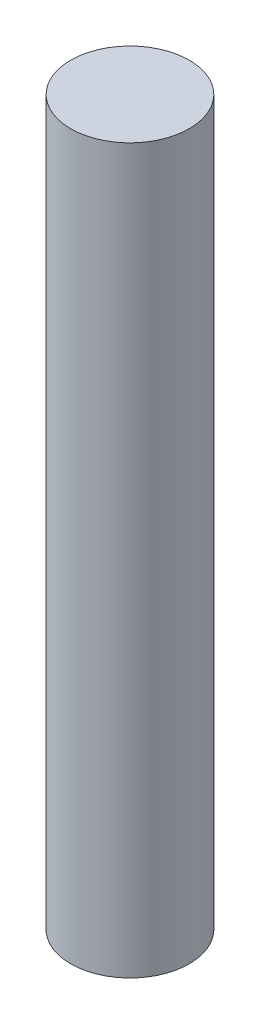
ISO-10303-21;
HEADER;
FILE_DESCRIPTION(('STEP AP214'),'2;1');
FILE_NAME('part.step','',(''),(''),'','','');
FILE_SCHEMA(('AUTOMOTIVE_DESIGN { 1 0 10303 214 1 1 1 1 }'));
ENDSEC;
DATA;
#1=APPLICATION_CONTEXT('core data for automotive mechanical design processes');
#2=APPLICATION_PROTOCOL_DEFINITION('international standard','automotive_design',2000,#1);
#3=PRODUCT_CONTEXT('',#1,'mechanical');
#4=PRODUCT('Part','Part','',(#3));
#5=PRODUCT_RELATED_PRODUCT_CATEGORY('part','',(#4));
#6=PRODUCT_DEFINITION_FORMATION('','',#4);
#7=PRODUCT_DEFINITION_CONTEXT('part definition',#1,'design');
#8=PRODUCT_DEFINITION('design','',#6,#7);
#9=PRODUCT_DEFINITION_SHAPE('','',#8);
#10=(LENGTH_UNIT() NAMED_UNIT(*) SI_UNIT(.MILLI.,.METRE.));
#11=(NAMED_UNIT(*) PLANE_ANGLE_UNIT() SI_UNIT($,.RADIAN.));
#12=(NAMED_UNIT(*) SI_UNIT($,.STERADIAN.) SOLID_ANGLE_UNIT());
#13=UNCERTAINTY_MEASURE_WITH_UNIT(LENGTH_MEASURE(1.E-05),#10,'distance_accuracy_value','');
#14=(GEOMETRIC_REPRESENTATION_CONTEXT(3) GLOBAL_UNCERTAINTY_ASSIGNED_CONTEXT((#13)) GLOBAL_UNIT_ASSIGNED_CONTEXT((#10,
#11,#12)) REPRESENTATION_CONTEXT('',''));
#15=CARTESIAN_POINT('',(0.,0.,0.));
#16=DIRECTION('',(0.,0.,1.));
#17=DIRECTION('',(1.,0.,0.));
#18=AXIS2_PLACEMENT_3D('',#15,#16,#17);
#19=CARTESIAN_POINT('',(0.,30.48,0.));
#20=DIRECTION('',(0.,-1.,0.));
#21=DIRECTION('',(0.,0.,1.));
#22=AXIS2_PLACEMENT_3D('',#19,#20,#21);
#23=CYLINDRICAL_SURFACE('',#22,2.5);
#24=CARTESIAN_POINT('',(0.,30.48,0.));
#25=DIRECTION('',(0.,-1.,0.));
#26=DIRECTION('',(0.,0.,-1.));
#27=AXIS2_PLACEMENT_3D('',#24,#25,#26);
#28=CIRCLE('',#27,2.5);
#29=CARTESIAN_POINT('',(0.,30.48,2.5));
#30=VERTEX_POINT('',#29);
#31=EDGE_CURVE('E10',#30,#30,#28,.T.);
#32=CARTESIAN_POINT('',(0.,0.,0.));
#33=DIRECTION('',(0.,-1.,0.));
#34=DIRECTION('',(0.,0.,-1.));
#35=AXIS2_PLACEMENT_3D('',#32,#33,#34);
#36=CIRCLE('',#35,2.5);
#37=CARTESIAN_POINT('',(0.,0.,2.5));
#38=VERTEX_POINT('',#37);
#39=EDGE_CURVE('E44',#38,#38,#36,.T.);
#40=CARTESIAN_POINT('',(0.,30.48,2.5));
#41=CARTESIAN_POINT('',(0.,30.1625,2.5));
#42=CARTESIAN_POINT('',(0.,29.845,2.5));
#43=CARTESIAN_POINT('',(0.,29.21,2.5));
#44=CARTESIAN_POINT('',(0.,28.8925,2.5));
#45=CARTESIAN_POINT('',(0.,28.2575,2.5));
#46=CARTESIAN_POINT('',(0.,27.94,2.5));
#47=CARTESIAN_POINT('',(0.,27.305,2.5));
#48=CARTESIAN_POINT('',(0.,26.9875,2.5));
#49=CARTESIAN_POINT('',(0.,26.3525,2.5));
#50=CARTESIAN_POINT('',(0.,26.035,2.5));
#51=CARTESIAN_POINT('',(0.,25.4,2.5));
#52=CARTESIAN_POINT('',(0.,25.0825,2.5));
#53=CARTESIAN_POINT('',(0.,24.4475,2.5));
#54=CARTESIAN_POINT('',(0.,24.13,2.5));
#55=CARTESIAN_POINT('',(0.,23.495,2.5));
#56=CARTESIAN_POINT('',(0.,23.1775,2.5));
#57=CARTESIAN_POINT('',(0.,22.5425,2.5));
#58=CARTESIAN_POINT('',(0.,22.225,2.5));
#59=CARTESIAN_POINT('',(0.,21.59,2.5));
#60=CARTESIAN_POINT('',(0.,21.2725,2.5));
#61=CARTESIAN_POINT('',(0.,20.6375,2.5));
#62=CARTESIAN_POINT('',(0.,20.32,2.5));
#63=CARTESIAN_POINT('',(0.,19.685,2.5));
#64=CARTESIAN_POINT('',(0.,19.3675,2.5));
#65=CARTESIAN_POINT('',(0.,18.7325,2.5));
#66=CARTESIAN_POINT('',(0.,18.415,2.5));
#67=CARTESIAN_POINT('',(0.,17.78,2.5));
#68=CARTESIAN_POINT('',(0.,17.4625,2.5));
#69=CARTESIAN_POINT('',(0.,16.8275,2.5));
#70=CARTESIAN_POINT('',(0.,16.51,2.5));
#71=CARTESIAN_POINT('',(0.,15.875,2.5));
#72=CARTESIAN_POINT('',(0.,15.5575,2.5));
#73=CARTESIAN_POINT('',(0.,14.9225,2.5));
#74=CARTESIAN_POINT('',(0.,14.605,2.5));
#75=CARTESIAN_POINT('',(0.,13.97,2.5));
#76=CARTESIAN_POINT('',(0.,13.6525,2.5));
#77=CARTESIAN_POINT('',(0.,13.0175,2.5));
#78=CARTESIAN_POINT('',(0.,12.7,2.5));
#79=CARTESIAN_POINT('',(0.,12.065,2.5));
#80=CARTESIAN_POINT('',(0.,11.7475,2.5));
#81=CARTESIAN_POINT('',(0.,11.1125,2.5));
#82=CARTESIAN_POINT('',(0.,10.795,2.5));
#83=CARTESIAN_POINT('',(0.,10.16,2.5));
#84=CARTESIAN_POINT('',(0.,9.8425,2.5));
#85=CARTESIAN_POINT('',(0.,9.2075,2.5));
#86=CARTESIAN_POINT('',(0.,8.89,2.5));
#87=CARTESIAN_POINT('',(0.,8.255,2.5));
#88=CARTESIAN_POINT('',(0.,7.9375,2.5));
#89=CARTESIAN_POINT('',(0.,7.3025,2.5));
#90=CARTESIAN_POINT('',(0.,6.985,2.5));
#91=CARTESIAN_POINT('',(0.,6.35,2.5));
#92=CARTESIAN_POINT('',(0.,6.0325,2.5));
#93=CARTESIAN_POINT('',(0.,5.3975,2.5));
#94=CARTESIAN_POINT('',(0.,5.08,2.5));
#95=CARTESIAN_POINT('',(0.,4.445,2.5));
#96=CARTESIAN_POINT('',(0.,4.1275,2.5));
#97=CARTESIAN_POINT('',(0.,3.4925,2.5));
#98=CARTESIAN_POINT('',(0.,3.175,2.5));
#99=CARTESIAN_POINT('',(0.,2.54,2.5));
#100=CARTESIAN_POINT('',(0.,2.2225,2.5));
#101=CARTESIAN_POINT('',(0.,1.5875,2.5));
#102=CARTESIAN_POINT('',(0.,1.27,2.5));
#103=CARTESIAN_POINT('',(0.,0.634999999999999,2.5));
#104=CARTESIAN_POINT('',(0.,0.3175,2.5));
#105=CARTESIAN_POINT('',(0.,0.,2.5));
#106=B_SPLINE_CURVE_WITH_KNOTS('',3,(#40,#41,#42,#43,#44,#45,#46,#47,#48,#49,#50,#51,#52,#53,
#54,#55,#56,#57,#58,#59,#60,#61,#62,#63,#64,#65,#66,#67,#68,#69,#70,#71,#72,#73,#74,#75,#76,#77,
#78,#79,#80,#81,#82,#83,#84,#85,#86,#87,#88,#89,#90,#91,#92,#93,#94,#95,#96,#97,#98,#99,#100,
#101,#102,#103,#104,#105),.UNSPECIFIED.,.F.,.F.,(4,2,2,2,2,2,2,2,2,2,2,2,2,2,2,2,2,2,2,2,2,2,2,
2,2,2,2,2,2,2,2,2,4),(0.,0.952499999999998,1.905,2.8575,3.81,4.7625,5.715,6.6675,7.62,8.5725,
9.525,10.4775,11.43,12.3825,13.335,14.2875,15.24,16.1925,17.145,18.0975,19.05,20.0025,20.955,
21.9075,22.86,23.8125,24.765,25.7175,26.67,27.6225,28.575,29.5275,30.48),.UNSPECIFIED.);
#107=EDGE_CURVE('BSEAM41',#30,#38,#106,.T.);
#108=ORIENTED_EDGE('',*,*,#31,.T.);
#109=ORIENTED_EDGE('',*,*,#39,.F.);
#110=ORIENTED_EDGE('',*,*,#107,.T.);
#111=ORIENTED_EDGE('',*,*,#107,.F.);
#112=EDGE_LOOP('',(#108,#110,#109,#111));
#113=FACE_BOUND('',#112,.T.);
#114=ADVANCED_FACE('F41',(#113),#23,.T.);
#115=CARTESIAN_POINT('',(0.,30.48,0.));
#116=DIRECTION('',(0.,1.,0.));
#117=DIRECTION('',(0.,0.,-1.));
#118=AXIS2_PLACEMENT_3D('',#115,#116,#117);
#119=PLANE('',#118);
#120=ORIENTED_EDGE('',*,*,#31,.F.);
#121=EDGE_LOOP('',(#120));
#122=FACE_BOUND('',#121,.T.);
#123=ADVANCED_FACE('F56',(#122),#119,.T.);
#124=CARTESIAN_POINT('',(0.,0.,0.));
#125=DIRECTION('',(0.,1.,0.));
#126=DIRECTION('',(0.,0.,-1.));
#127=AXIS2_PLACEMENT_3D('',#124,#125,#126);
#128=PLANE('',#127);
#129=ORIENTED_EDGE('',*,*,#39,.T.);
#130=EDGE_LOOP('',(#129));
#131=FACE_BOUND('',#130,.T.);
#132=ADVANCED_FACE('F53',(#131),#128,.F.);
#133=CLOSED_SHELL('',(#114,#123,#132));
#134=MANIFOLD_SOLID_BREP('B2',#133);
#135=ADVANCED_BREP_SHAPE_REPRESENTATION('',(#18,#134),#14);
#136=SHAPE_DEFINITION_REPRESENTATION(#9,#135);
ENDSEC;
END-ISO-10303-21;
